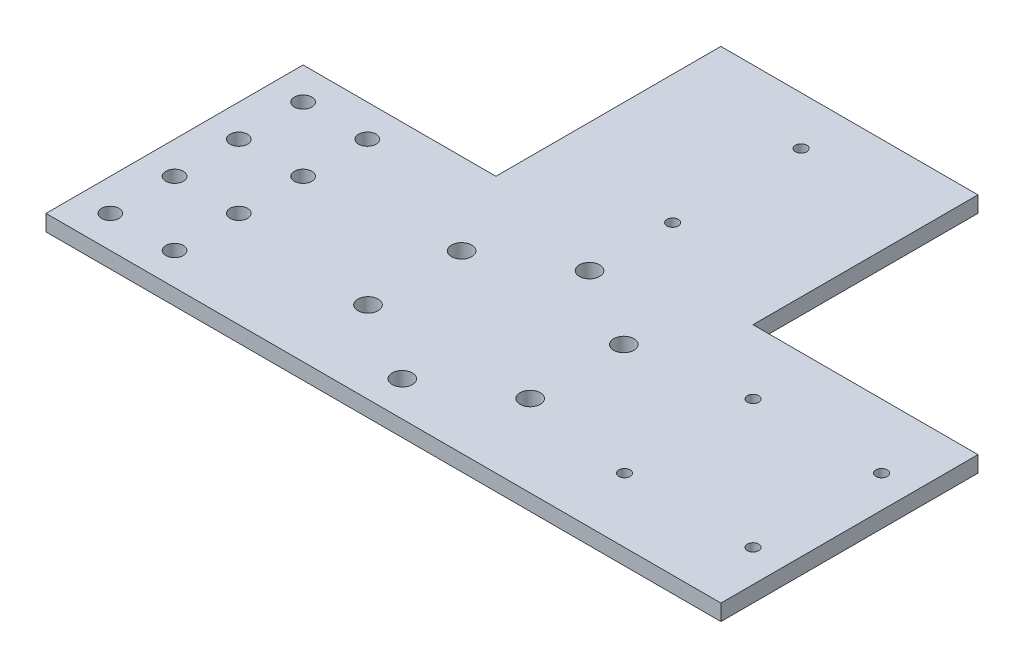
ISO-10303-21;
HEADER;
FILE_DESCRIPTION(('STEP AP214'),'2;1');
FILE_NAME('part.step','',(''),(''),'','','');
FILE_SCHEMA(('AUTOMOTIVE_DESIGN { 1 0 10303 214 1 1 1 1 }'));
ENDSEC;
DATA;
#1=APPLICATION_CONTEXT('core data for automotive mechanical design processes');
#2=APPLICATION_PROTOCOL_DEFINITION('international standard','automotive_design',2000,#1);
#3=PRODUCT_CONTEXT('',#1,'mechanical');
#4=PRODUCT('Part','Part','',(#3));
#5=PRODUCT_RELATED_PRODUCT_CATEGORY('part','',(#4));
#6=PRODUCT_DEFINITION_FORMATION('','',#4);
#7=PRODUCT_DEFINITION_CONTEXT('part definition',#1,'design');
#8=PRODUCT_DEFINITION('design','',#6,#7);
#9=PRODUCT_DEFINITION_SHAPE('','',#8);
#10=(LENGTH_UNIT() NAMED_UNIT(*) SI_UNIT(.MILLI.,.METRE.));
#11=(NAMED_UNIT(*) PLANE_ANGLE_UNIT() SI_UNIT($,.RADIAN.));
#12=(NAMED_UNIT(*) SI_UNIT($,.STERADIAN.) SOLID_ANGLE_UNIT());
#13=UNCERTAINTY_MEASURE_WITH_UNIT(LENGTH_MEASURE(1.E-05),#10,'distance_accuracy_value','');
#14=(GEOMETRIC_REPRESENTATION_CONTEXT(3) GLOBAL_UNCERTAINTY_ASSIGNED_CONTEXT((#13)) GLOBAL_UNIT_ASSIGNED_CONTEXT((#10,
#11,#12)) REPRESENTATION_CONTEXT('',''));
#15=CARTESIAN_POINT('',(0.,0.,0.));
#16=DIRECTION('',(0.,0.,1.));
#17=DIRECTION('',(1.,0.,0.));
#18=AXIS2_PLACEMENT_3D('',#15,#16,#17);
#19=CARTESIAN_POINT('',(-31.75,3.175,31.75));
#20=DIRECTION('',(0.,0.,-1.));
#21=DIRECTION('',(-1.,0.,0.));
#22=AXIS2_PLACEMENT_3D('',#19,#20,#21);
#23=PLANE('',#22);
#24=DIRECTION('',(0.,-1.,0.));
#25=VECTOR('',#24,1.);
#26=CARTESIAN_POINT('',(101.615635467388,3.175,31.75));
#27=LINE('',#26,#25);
#28=CARTESIAN_POINT('',(101.615635467388,3.175,31.75));
#29=VERTEX_POINT('',#28);
#30=CARTESIAN_POINT('',(101.615635467388,0.,31.75));
#31=VERTEX_POINT('',#30);
#32=EDGE_CURVE('E153',#29,#31,#27,.T.);
#33=ORIENTED_EDGE('',*,*,#32,.F.);
#34=DIRECTION('',(1.,0.,0.));
#35=VECTOR('',#34,1.);
#36=CARTESIAN_POINT('',(-31.75,3.175,31.75));
#37=LINE('',#36,#35);
#38=CARTESIAN_POINT('',(-31.75,3.175,31.75));
#39=VERTEX_POINT('',#38);
#40=EDGE_CURVE('E233',#39,#29,#37,.T.);
#41=ORIENTED_EDGE('',*,*,#40,.F.);
#42=DIRECTION('',(0.,-1.,0.));
#43=VECTOR('',#42,1.);
#44=CARTESIAN_POINT('',(-31.75,3.175,31.75));
#45=LINE('',#44,#43);
#46=CARTESIAN_POINT('',(-31.75,0.,31.75));
#47=VERTEX_POINT('',#46);
#48=EDGE_CURVE('E167',#39,#47,#45,.T.);
#49=ORIENTED_EDGE('',*,*,#48,.T.);
#50=DIRECTION('',(1.,0.,0.));
#51=VECTOR('',#50,1.);
#52=CARTESIAN_POINT('',(-31.75,0.,31.75));
#53=LINE('',#52,#51);
#54=EDGE_CURVE('E130',#47,#31,#53,.T.);
#55=ORIENTED_EDGE('',*,*,#54,.T.);
#56=EDGE_LOOP('',(#33,#41,#49,#55));
#57=FACE_BOUND('',#56,.T.);
#58=ADVANCED_FACE('F85',(#57),#23,.F.);
#59=CARTESIAN_POINT('',(-31.75,3.175,-19.05));
#60=DIRECTION('',(0.,0.,-1.));
#61=DIRECTION('',(-1.,0.,0.));
#62=AXIS2_PLACEMENT_3D('',#59,#60,#61);
#63=PLANE('',#62);
#64=DIRECTION('',(0.,1.,0.));
#65=VECTOR('',#64,1.);
#66=CARTESIAN_POINT('',(6.34999999999999,3.175,-19.05));
#67=LINE('',#66,#65);
#68=CARTESIAN_POINT('',(6.34999999999999,0.,-19.05));
#69=VERTEX_POINT('',#68);
#70=CARTESIAN_POINT('',(6.34999999999999,3.175,-19.05));
#71=VERTEX_POINT('',#70);
#72=EDGE_CURVE('E12',#69,#71,#67,.T.);
#73=ORIENTED_EDGE('',*,*,#72,.F.);
#74=DIRECTION('',(1.,0.,0.));
#75=VECTOR('',#74,1.);
#76=CARTESIAN_POINT('',(-31.75,0.,-19.05));
#77=LINE('',#76,#75);
#78=CARTESIAN_POINT('',(-31.75,0.,-19.05));
#79=VERTEX_POINT('',#78);
#80=EDGE_CURVE('E143',#79,#69,#77,.T.);
#81=ORIENTED_EDGE('',*,*,#80,.F.);
#82=DIRECTION('',(0.,-1.,0.));
#83=VECTOR('',#82,1.);
#84=CARTESIAN_POINT('',(-31.75,3.175,-19.05));
#85=LINE('',#84,#83);
#86=CARTESIAN_POINT('',(-31.75,3.175,-19.05));
#87=VERTEX_POINT('',#86);
#88=EDGE_CURVE('E165',#87,#79,#85,.T.);
#89=ORIENTED_EDGE('',*,*,#88,.F.);
#90=DIRECTION('',(1.,0.,0.));
#91=VECTOR('',#90,1.);
#92=CARTESIAN_POINT('',(-31.75,3.175,-19.05));
#93=LINE('',#92,#91);
#94=EDGE_CURVE('E224',#87,#71,#93,.T.);
#95=ORIENTED_EDGE('',*,*,#94,.T.);
#96=EDGE_LOOP('',(#73,#81,#89,#95));
#97=FACE_BOUND('',#96,.T.);
#98=ADVANCED_FACE('F223',(#97),#63,.T.);
#99=CARTESIAN_POINT('',(-31.75,3.175,31.75));
#100=DIRECTION('',(-1.,0.,0.));
#101=DIRECTION('',(0.,0.,1.));
#102=AXIS2_PLACEMENT_3D('',#99,#100,#101);
#103=PLANE('',#102);
#104=DIRECTION('',(0.,0.,-1.));
#105=VECTOR('',#104,1.);
#106=CARTESIAN_POINT('',(-31.75,0.,31.75));
#107=LINE('',#106,#105);
#108=EDGE_CURVE('E232',#47,#79,#107,.T.);
#109=ORIENTED_EDGE('',*,*,#108,.F.);
#110=ORIENTED_EDGE('',*,*,#48,.F.);
#111=DIRECTION('',(0.,0.,-1.));
#112=VECTOR('',#111,1.);
#113=CARTESIAN_POINT('',(-31.75,3.175,31.75));
#114=LINE('',#113,#112);
#115=EDGE_CURVE('E174',#39,#87,#114,.T.);
#116=ORIENTED_EDGE('',*,*,#115,.T.);
#117=ORIENTED_EDGE('',*,*,#88,.T.);
#118=EDGE_LOOP('',(#109,#110,#116,#117));
#119=FACE_BOUND('',#118,.T.);
#120=ADVANCED_FACE('F227',(#119),#103,.T.);
#121=CARTESIAN_POINT('',(57.15,0.,-19.05));
#122=VERTEX_POINT('',#121);
#123=CARTESIAN_POINT('',(101.615635467388,0.,-19.05));
#124=VERTEX_POINT('',#123);
#125=EDGE_CURVE('E136',#122,#124,#77,.T.);
#126=ORIENTED_EDGE('',*,*,#125,.F.);
#127=DIRECTION('',(0.,1.,0.));
#128=VECTOR('',#127,1.);
#129=CARTESIAN_POINT('',(57.15,3.175,-19.05));
#130=LINE('',#129,#128);
#131=CARTESIAN_POINT('',(57.15,3.175,-19.05));
#132=VERTEX_POINT('',#131);
#133=EDGE_CURVE('E94',#122,#132,#130,.T.);
#134=ORIENTED_EDGE('',*,*,#133,.T.);
#135=CARTESIAN_POINT('',(101.615635467388,3.175,-19.05));
#136=VERTEX_POINT('',#135);
#137=EDGE_CURVE('E149',#132,#136,#93,.T.);
#138=ORIENTED_EDGE('',*,*,#137,.T.);
#139=DIRECTION('',(0.,-1.,0.));
#140=VECTOR('',#139,1.);
#141=CARTESIAN_POINT('',(101.615635467388,3.175,-19.05));
#142=LINE('',#141,#140);
#143=EDGE_CURVE('E146',#136,#124,#142,.T.);
#144=ORIENTED_EDGE('',*,*,#143,.T.);
#145=EDGE_LOOP('',(#126,#134,#138,#144));
#146=FACE_BOUND('',#145,.T.);
#147=ADVANCED_FACE('F147',(#146),#63,.T.);
#148=CARTESIAN_POINT('',(0.,0.,0.));
#149=DIRECTION('',(0.,1.,0.));
#150=DIRECTION('',(0.,0.,1.));
#151=AXIS2_PLACEMENT_3D('',#148,#149,#150);
#152=PLANE('',#151);
#153=CARTESIAN_POINT('',(31.75,0.,-53.975));
#154=DIRECTION('',(0.,1.,0.));
#155=DIRECTION('',(0.,0.,1.));
#156=AXIS2_PLACEMENT_3D('',#153,#154,#155);
#157=CIRCLE('',#156,1.1303);
#158=CARTESIAN_POINT('',(31.75,0.,-52.8447));
#159=VERTEX_POINT('',#158);
#160=EDGE_CURVE('E345',#159,#159,#157,.T.);
#161=ORIENTED_EDGE('',*,*,#160,.T.);
#162=EDGE_LOOP('',(#161));
#163=FACE_BOUND('',#162,.T.);
#164=CARTESIAN_POINT('',(31.75,0.,-28.575));
#165=DIRECTION('',(0.,1.,0.));
#166=DIRECTION('',(0.,0.,1.));
#167=AXIS2_PLACEMENT_3D('',#164,#165,#166);
#168=CIRCLE('',#167,1.1303);
#169=CARTESIAN_POINT('',(31.75,0.,-27.4447));
#170=VERTEX_POINT('',#169);
#171=EDGE_CURVE('E339',#170,#170,#168,.T.);
#172=ORIENTED_EDGE('',*,*,#171,.T.);
#173=EDGE_LOOP('',(#172));
#174=FACE_BOUND('',#173,.T.);
#175=CARTESIAN_POINT('',(69.8656354673881,0.,-6.35000000000003));
#176=DIRECTION('',(0.,1.,0.));
#177=DIRECTION('',(0.,0.,1.));
#178=AXIS2_PLACEMENT_3D('',#175,#176,#177);
#179=CIRCLE('',#178,1.1303);
#180=CARTESIAN_POINT('',(69.8656354673881,0.,-5.21970000000003));
#181=VERTEX_POINT('',#180);
#182=EDGE_CURVE('E333',#181,#181,#179,.T.);
#183=ORIENTED_EDGE('',*,*,#182,.T.);
#184=EDGE_LOOP('',(#183));
#185=FACE_BOUND('',#184,.T.);
#186=CARTESIAN_POINT('',(95.2656354673881,0.,-6.35000000000003));
#187=DIRECTION('',(0.,1.,0.));
#188=DIRECTION('',(0.,0.,1.));
#189=AXIS2_PLACEMENT_3D('',#186,#187,#188);
#190=CIRCLE('',#189,1.1303);
#191=CARTESIAN_POINT('',(95.2656354673881,0.,-5.21970000000003));
#192=VERTEX_POINT('',#191);
#193=EDGE_CURVE('E327',#192,#192,#190,.T.);
#194=ORIENTED_EDGE('',*,*,#193,.T.);
#195=EDGE_LOOP('',(#194));
#196=FACE_BOUND('',#195,.T.);
#197=CARTESIAN_POINT('',(95.2656354673881,0.,19.05));
#198=DIRECTION('',(0.,1.,0.));
#199=DIRECTION('',(0.,0.,1.));
#200=AXIS2_PLACEMENT_3D('',#197,#198,#199);
#201=CIRCLE('',#200,1.1303);
#202=CARTESIAN_POINT('',(95.2656354673881,0.,20.1803));
#203=VERTEX_POINT('',#202);
#204=EDGE_CURVE('E321',#203,#203,#201,.T.);
#205=ORIENTED_EDGE('',*,*,#204,.T.);
#206=EDGE_LOOP('',(#205));
#207=FACE_BOUND('',#206,.T.);
#208=CARTESIAN_POINT('',(69.8656354673881,0.,19.05));
#209=DIRECTION('',(0.,1.,0.));
#210=DIRECTION('',(0.,0.,1.));
#211=AXIS2_PLACEMENT_3D('',#208,#209,#210);
#212=CIRCLE('',#211,1.1303);
#213=CARTESIAN_POINT('',(69.8656354673881,0.,20.1803));
#214=VERTEX_POINT('',#213);
#215=EDGE_CURVE('E315',#214,#214,#212,.T.);
#216=ORIENTED_EDGE('',*,*,#215,.T.);
#217=EDGE_LOOP('',(#216));
#218=FACE_BOUND('',#217,.T.);
#219=CARTESIAN_POINT('',(31.75,0.,-12.15));
#220=DIRECTION('',(0.,1.,0.));
#221=DIRECTION('',(0.,0.,1.));
#222=AXIS2_PLACEMENT_3D('',#219,#220,#221);
#223=CIRCLE('',#222,2.);
#224=CARTESIAN_POINT('',(31.75,0.,-10.15));
#225=VERTEX_POINT('',#224);
#226=EDGE_CURVE('E309',#225,#225,#223,.T.);
#227=ORIENTED_EDGE('',*,*,#226,.T.);
#228=EDGE_LOOP('',(#227));
#229=FACE_BOUND('',#228,.T.);
#230=CARTESIAN_POINT('',(47.7714699700119,0.,-2.90000000000032));
#231=DIRECTION('',(0.,1.,0.));
#232=DIRECTION('',(0.,0.,1.));
#233=AXIS2_PLACEMENT_3D('',#230,#231,#232);
#234=CIRCLE('',#233,2.);
#235=CARTESIAN_POINT('',(47.7714699700119,0.,-0.900000000000315));
#236=VERTEX_POINT('',#235);
#237=EDGE_CURVE('E303',#236,#236,#234,.T.);
#238=ORIENTED_EDGE('',*,*,#237,.T.);
#239=EDGE_LOOP('',(#238));
#240=FACE_BOUND('',#239,.T.);
#241=CARTESIAN_POINT('',(47.7714699700121,0.,15.5999999999994));
#242=DIRECTION('',(0.,1.,0.));
#243=DIRECTION('',(0.,0.,1.));
#244=AXIS2_PLACEMENT_3D('',#241,#242,#243);
#245=CIRCLE('',#244,2.);
#246=CARTESIAN_POINT('',(47.7714699700121,0.,17.5999999999994));
#247=VERTEX_POINT('',#246);
#248=EDGE_CURVE('E297',#247,#247,#245,.T.);
#249=ORIENTED_EDGE('',*,*,#248,.T.);
#250=EDGE_LOOP('',(#249));
#251=FACE_BOUND('',#250,.T.);
#252=CARTESIAN_POINT('',(31.7500000000003,0.,24.8499999999994));
#253=DIRECTION('',(0.,1.,0.));
#254=DIRECTION('',(0.,0.,1.));
#255=AXIS2_PLACEMENT_3D('',#252,#253,#254);
#256=CIRCLE('',#255,2.);
#257=CARTESIAN_POINT('',(31.7500000000003,0.,26.8499999999994));
#258=VERTEX_POINT('',#257);
#259=EDGE_CURVE('E291',#258,#258,#256,.T.);
#260=ORIENTED_EDGE('',*,*,#259,.T.);
#261=EDGE_LOOP('',(#260));
#262=FACE_BOUND('',#261,.T.);
#263=CARTESIAN_POINT('',(15.7285300299884,0.,15.5999999999997));
#264=DIRECTION('',(0.,1.,0.));
#265=DIRECTION('',(0.,0.,1.));
#266=AXIS2_PLACEMENT_3D('',#263,#264,#265);
#267=CIRCLE('',#266,2.);
#268=CARTESIAN_POINT('',(15.7285300299884,0.,17.5999999999997));
#269=VERTEX_POINT('',#268);
#270=EDGE_CURVE('E285',#269,#269,#267,.T.);
#271=ORIENTED_EDGE('',*,*,#270,.T.);
#272=EDGE_LOOP('',(#271));
#273=FACE_BOUND('',#272,.T.);
#274=CARTESIAN_POINT('',(15.7285300299882,0.,-2.90000000000002));
#275=DIRECTION('',(0.,1.,0.));
#276=DIRECTION('',(0.,0.,1.));
#277=AXIS2_PLACEMENT_3D('',#274,#275,#276);
#278=CIRCLE('',#277,2.);
#279=CARTESIAN_POINT('',(15.7285300299882,0.,-0.900000000000022));
#280=VERTEX_POINT('',#279);
#281=EDGE_CURVE('E279',#280,#280,#278,.T.);
#282=ORIENTED_EDGE('',*,*,#281,.T.);
#283=EDGE_LOOP('',(#282));
#284=FACE_BOUND('',#283,.T.);
#285=CARTESIAN_POINT('',(-12.6999999999999,0.,0.));
#286=DIRECTION('',(0.,1.,0.));
#287=DIRECTION('',(0.,0.,1.));
#288=AXIS2_PLACEMENT_3D('',#285,#286,#287);
#289=CIRCLE('',#288,1.7272);
#290=CARTESIAN_POINT('',(-12.6999999999999,0.,1.72719999999998));
#291=VERTEX_POINT('',#290);
#292=EDGE_CURVE('E273',#291,#291,#289,.T.);
#293=ORIENTED_EDGE('',*,*,#292,.T.);
#294=EDGE_LOOP('',(#293));
#295=FACE_BOUND('',#294,.T.);
#296=CARTESIAN_POINT('',(-25.3999999999999,0.,0.));
#297=DIRECTION('',(0.,1.,0.));
#298=DIRECTION('',(0.,0.,1.));
#299=AXIS2_PLACEMENT_3D('',#296,#297,#298);
#300=CIRCLE('',#299,1.7272);
#301=CARTESIAN_POINT('',(-25.3999999999999,0.,1.72719999999997));
#302=VERTEX_POINT('',#301);
#303=EDGE_CURVE('E267',#302,#302,#300,.T.);
#304=ORIENTED_EDGE('',*,*,#303,.T.);
#305=EDGE_LOOP('',(#304));
#306=FACE_BOUND('',#305,.T.);
#307=CARTESIAN_POINT('',(-25.3999999999997,0.,12.7));
#308=DIRECTION('',(0.,1.,0.));
#309=DIRECTION('',(0.,0.,1.));
#310=AXIS2_PLACEMENT_3D('',#307,#308,#309);
#311=CIRCLE('',#310,1.7272);
#312=CARTESIAN_POINT('',(-25.3999999999997,0.,14.4272));
#313=VERTEX_POINT('',#312);
#314=EDGE_CURVE('E261',#313,#313,#311,.T.);
#315=ORIENTED_EDGE('',*,*,#314,.T.);
#316=EDGE_LOOP('',(#315));
#317=FACE_BOUND('',#316,.T.);
#318=CARTESIAN_POINT('',(-25.3999999999996,0.,25.4));
#319=DIRECTION('',(0.,1.,0.));
#320=DIRECTION('',(0.,0.,1.));
#321=AXIS2_PLACEMENT_3D('',#318,#319,#320);
#322=CIRCLE('',#321,1.7272);
#323=CARTESIAN_POINT('',(-25.3999999999996,0.,27.1272));
#324=VERTEX_POINT('',#323);
#325=EDGE_CURVE('E255',#324,#324,#322,.T.);
#326=ORIENTED_EDGE('',*,*,#325,.T.);
#327=EDGE_LOOP('',(#326));
#328=FACE_BOUND('',#327,.T.);
#329=CARTESIAN_POINT('',(-12.6999999999996,0.,25.4));
#330=DIRECTION('',(0.,1.,0.));
#331=DIRECTION('',(0.,0.,1.));
#332=AXIS2_PLACEMENT_3D('',#329,#330,#331);
#333=CIRCLE('',#332,1.7272);
#334=CARTESIAN_POINT('',(-12.6999999999996,0.,27.1272));
#335=VERTEX_POINT('',#334);
#336=EDGE_CURVE('E249',#335,#335,#333,.T.);
#337=ORIENTED_EDGE('',*,*,#336,.T.);
#338=EDGE_LOOP('',(#337));
#339=FACE_BOUND('',#338,.T.);
#340=CARTESIAN_POINT('',(-12.7,0.,-12.7));
#341=DIRECTION('',(0.,1.,0.));
#342=DIRECTION('',(0.,0.,1.));
#343=AXIS2_PLACEMENT_3D('',#340,#341,#342);
#344=CIRCLE('',#343,1.7272);
#345=CARTESIAN_POINT('',(-12.7,0.,-10.9728));
#346=VERTEX_POINT('',#345);
#347=EDGE_CURVE('E243',#346,#346,#344,.T.);
#348=ORIENTED_EDGE('',*,*,#347,.T.);
#349=EDGE_LOOP('',(#348));
#350=FACE_BOUND('',#349,.T.);
#351=CARTESIAN_POINT('',(-25.4,0.,-12.7));
#352=DIRECTION('',(0.,1.,0.));
#353=DIRECTION('',(0.,0.,1.));
#354=AXIS2_PLACEMENT_3D('',#351,#352,#353);
#355=CIRCLE('',#354,1.7272);
#356=CARTESIAN_POINT('',(-25.4,0.,-10.9728));
#357=VERTEX_POINT('',#356);
#358=EDGE_CURVE('E237',#357,#357,#355,.T.);
#359=ORIENTED_EDGE('',*,*,#358,.T.);
#360=EDGE_LOOP('',(#359));
#361=FACE_BOUND('',#360,.T.);
#362=CARTESIAN_POINT('',(-12.6999999999997,0.,12.7));
#363=DIRECTION('',(0.,1.,0.));
#364=DIRECTION('',(0.,0.,1.));
#365=AXIS2_PLACEMENT_3D('',#362,#363,#364);
#366=CIRCLE('',#365,1.7272);
#367=CARTESIAN_POINT('',(-12.6999999999997,0.,14.4272));
#368=VERTEX_POINT('',#367);
#369=EDGE_CURVE('E156',#368,#368,#366,.T.);
#370=ORIENTED_EDGE('',*,*,#369,.T.);
#371=EDGE_LOOP('',(#370));
#372=FACE_BOUND('',#371,.T.);
#373=DIRECTION('',(0.,0.,1.));
#374=VECTOR('',#373,1.);
#375=CARTESIAN_POINT('',(101.615635467388,0.,-19.05));
#376=LINE('',#375,#374);
#377=EDGE_CURVE('E140',#124,#31,#376,.T.);
#378=ORIENTED_EDGE('',*,*,#377,.T.);
#379=ORIENTED_EDGE('',*,*,#54,.F.);
#380=ORIENTED_EDGE('',*,*,#108,.T.);
#381=ORIENTED_EDGE('',*,*,#80,.T.);
#382=DIRECTION('',(0.,0.,-1.));
#383=VECTOR('',#382,1.);
#384=CARTESIAN_POINT('',(6.34999999999999,0.,31.75));
#385=LINE('',#384,#383);
#386=CARTESIAN_POINT('',(6.34999999999999,0.,-63.5));
#387=VERTEX_POINT('',#386);
#388=EDGE_CURVE('E182',#69,#387,#385,.T.);
#389=ORIENTED_EDGE('',*,*,#388,.T.);
#390=DIRECTION('',(1.,0.,0.));
#391=VECTOR('',#390,1.);
#392=CARTESIAN_POINT('',(6.34999999999999,0.,-63.5));
#393=LINE('',#392,#391);
#394=CARTESIAN_POINT('',(57.15,0.,-63.5));
#395=VERTEX_POINT('',#394);
#396=EDGE_CURVE('E164',#387,#395,#393,.T.);
#397=ORIENTED_EDGE('',*,*,#396,.T.);
#398=DIRECTION('',(0.,0.,-1.));
#399=VECTOR('',#398,1.);
#400=CARTESIAN_POINT('',(57.15,0.,31.75));
#401=LINE('',#400,#399);
#402=EDGE_CURVE('E142',#122,#395,#401,.T.);
#403=ORIENTED_EDGE('',*,*,#402,.F.);
#404=ORIENTED_EDGE('',*,*,#125,.T.);
#405=EDGE_LOOP('',(#378,#379,#380,#381,#389,#397,#403,#404));
#406=FACE_BOUND('',#405,.T.);
#407=ADVANCED_FACE('F138',(#163,#174,#185,#196,#207,#218,#229,#240,#251,#262,#273,#284,#295,
#306,#317,#328,#339,#350,#361,#372,#406),#152,.F.);
#408=CARTESIAN_POINT('',(0.,3.175,0.));
#409=DIRECTION('',(0.,1.,0.));
#410=DIRECTION('',(0.,0.,1.));
#411=AXIS2_PLACEMENT_3D('',#408,#409,#410);
#412=PLANE('',#411);
#413=CARTESIAN_POINT('',(31.75,3.175,-53.975));
#414=DIRECTION('',(0.,1.,0.));
#415=DIRECTION('',(0.,0.,1.));
#416=AXIS2_PLACEMENT_3D('',#413,#414,#415);
#417=CIRCLE('',#416,1.1303);
#418=CARTESIAN_POINT('',(31.75,3.175,-52.8447));
#419=VERTEX_POINT('',#418);
#420=EDGE_CURVE('E348',#419,#419,#417,.T.);
#421=ORIENTED_EDGE('',*,*,#420,.F.);
#422=EDGE_LOOP('',(#421));
#423=FACE_BOUND('',#422,.T.);
#424=CARTESIAN_POINT('',(31.75,3.175,-28.575));
#425=DIRECTION('',(0.,1.,0.));
#426=DIRECTION('',(0.,0.,1.));
#427=AXIS2_PLACEMENT_3D('',#424,#425,#426);
#428=CIRCLE('',#427,1.1303);
#429=CARTESIAN_POINT('',(31.75,3.175,-27.4447));
#430=VERTEX_POINT('',#429);
#431=EDGE_CURVE('E342',#430,#430,#428,.T.);
#432=ORIENTED_EDGE('',*,*,#431,.F.);
#433=EDGE_LOOP('',(#432));
#434=FACE_BOUND('',#433,.T.);
#435=CARTESIAN_POINT('',(69.8656354673881,3.175,-6.35000000000003));
#436=DIRECTION('',(0.,1.,0.));
#437=DIRECTION('',(0.,0.,1.));
#438=AXIS2_PLACEMENT_3D('',#435,#436,#437);
#439=CIRCLE('',#438,1.1303);
#440=CARTESIAN_POINT('',(69.8656354673881,3.175,-5.21970000000003));
#441=VERTEX_POINT('',#440);
#442=EDGE_CURVE('E336',#441,#441,#439,.T.);
#443=ORIENTED_EDGE('',*,*,#442,.F.);
#444=EDGE_LOOP('',(#443));
#445=FACE_BOUND('',#444,.T.);
#446=CARTESIAN_POINT('',(95.2656354673881,3.175,-6.35000000000003));
#447=DIRECTION('',(0.,1.,0.));
#448=DIRECTION('',(0.,0.,1.));
#449=AXIS2_PLACEMENT_3D('',#446,#447,#448);
#450=CIRCLE('',#449,1.1303);
#451=CARTESIAN_POINT('',(95.2656354673881,3.175,-5.21970000000003));
#452=VERTEX_POINT('',#451);
#453=EDGE_CURVE('E330',#452,#452,#450,.T.);
#454=ORIENTED_EDGE('',*,*,#453,.F.);
#455=EDGE_LOOP('',(#454));
#456=FACE_BOUND('',#455,.T.);
#457=CARTESIAN_POINT('',(95.2656354673881,3.175,19.05));
#458=DIRECTION('',(0.,1.,0.));
#459=DIRECTION('',(0.,0.,1.));
#460=AXIS2_PLACEMENT_3D('',#457,#458,#459);
#461=CIRCLE('',#460,1.1303);
#462=CARTESIAN_POINT('',(95.2656354673881,3.175,20.1803));
#463=VERTEX_POINT('',#462);
#464=EDGE_CURVE('E324',#463,#463,#461,.T.);
#465=ORIENTED_EDGE('',*,*,#464,.F.);
#466=EDGE_LOOP('',(#465));
#467=FACE_BOUND('',#466,.T.);
#468=CARTESIAN_POINT('',(69.8656354673881,3.175,19.05));
#469=DIRECTION('',(0.,1.,0.));
#470=DIRECTION('',(0.,0.,1.));
#471=AXIS2_PLACEMENT_3D('',#468,#469,#470);
#472=CIRCLE('',#471,1.1303);
#473=CARTESIAN_POINT('',(69.8656354673881,3.175,20.1803));
#474=VERTEX_POINT('',#473);
#475=EDGE_CURVE('E318',#474,#474,#472,.T.);
#476=ORIENTED_EDGE('',*,*,#475,.F.);
#477=EDGE_LOOP('',(#476));
#478=FACE_BOUND('',#477,.T.);
#479=CARTESIAN_POINT('',(31.75,3.175,-12.15));
#480=DIRECTION('',(0.,1.,0.));
#481=DIRECTION('',(0.,0.,1.));
#482=AXIS2_PLACEMENT_3D('',#479,#480,#481);
#483=CIRCLE('',#482,2.);
#484=CARTESIAN_POINT('',(31.75,3.175,-10.15));
#485=VERTEX_POINT('',#484);
#486=EDGE_CURVE('E312',#485,#485,#483,.T.);
#487=ORIENTED_EDGE('',*,*,#486,.F.);
#488=EDGE_LOOP('',(#487));
#489=FACE_BOUND('',#488,.T.);
#490=CARTESIAN_POINT('',(47.7714699700119,3.175,-2.90000000000032));
#491=DIRECTION('',(0.,1.,0.));
#492=DIRECTION('',(0.,0.,1.));
#493=AXIS2_PLACEMENT_3D('',#490,#491,#492);
#494=CIRCLE('',#493,2.);
#495=CARTESIAN_POINT('',(47.7714699700119,3.175,-0.900000000000315));
#496=VERTEX_POINT('',#495);
#497=EDGE_CURVE('E306',#496,#496,#494,.T.);
#498=ORIENTED_EDGE('',*,*,#497,.F.);
#499=EDGE_LOOP('',(#498));
#500=FACE_BOUND('',#499,.T.);
#501=CARTESIAN_POINT('',(47.7714699700121,3.175,15.5999999999994));
#502=DIRECTION('',(0.,1.,0.));
#503=DIRECTION('',(0.,0.,1.));
#504=AXIS2_PLACEMENT_3D('',#501,#502,#503);
#505=CIRCLE('',#504,2.);
#506=CARTESIAN_POINT('',(47.7714699700121,3.175,17.5999999999994));
#507=VERTEX_POINT('',#506);
#508=EDGE_CURVE('E300',#507,#507,#505,.T.);
#509=ORIENTED_EDGE('',*,*,#508,.F.);
#510=EDGE_LOOP('',(#509));
#511=FACE_BOUND('',#510,.T.);
#512=CARTESIAN_POINT('',(31.7500000000003,3.175,24.8499999999994));
#513=DIRECTION('',(0.,1.,0.));
#514=DIRECTION('',(0.,0.,1.));
#515=AXIS2_PLACEMENT_3D('',#512,#513,#514);
#516=CIRCLE('',#515,2.);
#517=CARTESIAN_POINT('',(31.7500000000003,3.175,26.8499999999994));
#518=VERTEX_POINT('',#517);
#519=EDGE_CURVE('E294',#518,#518,#516,.T.);
#520=ORIENTED_EDGE('',*,*,#519,.F.);
#521=EDGE_LOOP('',(#520));
#522=FACE_BOUND('',#521,.T.);
#523=CARTESIAN_POINT('',(15.7285300299884,3.175,15.5999999999997));
#524=DIRECTION('',(0.,1.,0.));
#525=DIRECTION('',(0.,0.,1.));
#526=AXIS2_PLACEMENT_3D('',#523,#524,#525);
#527=CIRCLE('',#526,2.);
#528=CARTESIAN_POINT('',(15.7285300299884,3.175,17.5999999999997));
#529=VERTEX_POINT('',#528);
#530=EDGE_CURVE('E288',#529,#529,#527,.T.);
#531=ORIENTED_EDGE('',*,*,#530,.F.);
#532=EDGE_LOOP('',(#531));
#533=FACE_BOUND('',#532,.T.);
#534=CARTESIAN_POINT('',(15.7285300299882,3.175,-2.90000000000002));
#535=DIRECTION('',(0.,1.,0.));
#536=DIRECTION('',(0.,0.,1.));
#537=AXIS2_PLACEMENT_3D('',#534,#535,#536);
#538=CIRCLE('',#537,2.);
#539=CARTESIAN_POINT('',(15.7285300299882,3.175,-0.900000000000019));
#540=VERTEX_POINT('',#539);
#541=EDGE_CURVE('E282',#540,#540,#538,.T.);
#542=ORIENTED_EDGE('',*,*,#541,.F.);
#543=EDGE_LOOP('',(#542));
#544=FACE_BOUND('',#543,.T.);
#545=CARTESIAN_POINT('',(-12.6999999999999,3.175,0.));
#546=DIRECTION('',(0.,1.,0.));
#547=DIRECTION('',(0.,0.,1.));
#548=AXIS2_PLACEMENT_3D('',#545,#546,#547);
#549=CIRCLE('',#548,1.7272);
#550=CARTESIAN_POINT('',(-12.6999999999999,3.175,1.72719999999998));
#551=VERTEX_POINT('',#550);
#552=EDGE_CURVE('E276',#551,#551,#549,.T.);
#553=ORIENTED_EDGE('',*,*,#552,.F.);
#554=EDGE_LOOP('',(#553));
#555=FACE_BOUND('',#554,.T.);
#556=CARTESIAN_POINT('',(-25.3999999999999,3.175,0.));
#557=DIRECTION('',(0.,1.,0.));
#558=DIRECTION('',(0.,0.,1.));
#559=AXIS2_PLACEMENT_3D('',#556,#557,#558);
#560=CIRCLE('',#559,1.7272);
#561=CARTESIAN_POINT('',(-25.3999999999999,3.175,1.72719999999997));
#562=VERTEX_POINT('',#561);
#563=EDGE_CURVE('E270',#562,#562,#560,.T.);
#564=ORIENTED_EDGE('',*,*,#563,.F.);
#565=EDGE_LOOP('',(#564));
#566=FACE_BOUND('',#565,.T.);
#567=CARTESIAN_POINT('',(-25.3999999999997,3.175,12.7));
#568=DIRECTION('',(0.,1.,0.));
#569=DIRECTION('',(0.,0.,1.));
#570=AXIS2_PLACEMENT_3D('',#567,#568,#569);
#571=CIRCLE('',#570,1.7272);
#572=CARTESIAN_POINT('',(-25.3999999999997,3.175,14.4272));
#573=VERTEX_POINT('',#572);
#574=EDGE_CURVE('E264',#573,#573,#571,.T.);
#575=ORIENTED_EDGE('',*,*,#574,.F.);
#576=EDGE_LOOP('',(#575));
#577=FACE_BOUND('',#576,.T.);
#578=CARTESIAN_POINT('',(-25.3999999999996,3.175,25.4));
#579=DIRECTION('',(0.,1.,0.));
#580=DIRECTION('',(0.,0.,1.));
#581=AXIS2_PLACEMENT_3D('',#578,#579,#580);
#582=CIRCLE('',#581,1.7272);
#583=CARTESIAN_POINT('',(-25.3999999999996,3.175,27.1272));
#584=VERTEX_POINT('',#583);
#585=EDGE_CURVE('E258',#584,#584,#582,.T.);
#586=ORIENTED_EDGE('',*,*,#585,.F.);
#587=EDGE_LOOP('',(#586));
#588=FACE_BOUND('',#587,.T.);
#589=CARTESIAN_POINT('',(-12.6999999999996,3.175,25.4));
#590=DIRECTION('',(0.,1.,0.));
#591=DIRECTION('',(0.,0.,1.));
#592=AXIS2_PLACEMENT_3D('',#589,#590,#591);
#593=CIRCLE('',#592,1.7272);
#594=CARTESIAN_POINT('',(-12.6999999999996,3.175,27.1272));
#595=VERTEX_POINT('',#594);
#596=EDGE_CURVE('E252',#595,#595,#593,.T.);
#597=ORIENTED_EDGE('',*,*,#596,.F.);
#598=EDGE_LOOP('',(#597));
#599=FACE_BOUND('',#598,.T.);
#600=CARTESIAN_POINT('',(-12.7,3.175,-12.7));
#601=DIRECTION('',(0.,1.,0.));
#602=DIRECTION('',(0.,0.,1.));
#603=AXIS2_PLACEMENT_3D('',#600,#601,#602);
#604=CIRCLE('',#603,1.7272);
#605=CARTESIAN_POINT('',(-12.7,3.175,-10.9728));
#606=VERTEX_POINT('',#605);
#607=EDGE_CURVE('E246',#606,#606,#604,.T.);
#608=ORIENTED_EDGE('',*,*,#607,.F.);
#609=EDGE_LOOP('',(#608));
#610=FACE_BOUND('',#609,.T.);
#611=CARTESIAN_POINT('',(-25.4,3.175,-12.7));
#612=DIRECTION('',(0.,1.,0.));
#613=DIRECTION('',(0.,0.,1.));
#614=AXIS2_PLACEMENT_3D('',#611,#612,#613);
#615=CIRCLE('',#614,1.7272);
#616=CARTESIAN_POINT('',(-25.4,3.175,-10.9728));
#617=VERTEX_POINT('',#616);
#618=EDGE_CURVE('E240',#617,#617,#615,.T.);
#619=ORIENTED_EDGE('',*,*,#618,.F.);
#620=EDGE_LOOP('',(#619));
#621=FACE_BOUND('',#620,.T.);
#622=CARTESIAN_POINT('',(-12.6999999999997,3.175,12.7));
#623=DIRECTION('',(0.,1.,0.));
#624=DIRECTION('',(0.,0.,1.));
#625=AXIS2_PLACEMENT_3D('',#622,#623,#624);
#626=CIRCLE('',#625,1.7272);
#627=CARTESIAN_POINT('',(-12.6999999999997,3.175,14.4272));
#628=VERTEX_POINT('',#627);
#629=EDGE_CURVE('E160',#628,#628,#626,.T.);
#630=ORIENTED_EDGE('',*,*,#629,.F.);
#631=EDGE_LOOP('',(#630));
#632=FACE_BOUND('',#631,.T.);
#633=ORIENTED_EDGE('',*,*,#137,.F.);
#634=DIRECTION('',(0.,0.,-1.));
#635=VECTOR('',#634,1.);
#636=CARTESIAN_POINT('',(57.15,3.175,31.75));
#637=LINE('',#636,#635);
#638=CARTESIAN_POINT('',(57.15,3.175,-63.5));
#639=VERTEX_POINT('',#638);
#640=EDGE_CURVE('E181',#132,#639,#637,.T.);
#641=ORIENTED_EDGE('',*,*,#640,.T.);
#642=DIRECTION('',(1.,0.,0.));
#643=VECTOR('',#642,1.);
#644=CARTESIAN_POINT('',(6.34999999999999,3.175,-63.5));
#645=LINE('',#644,#643);
#646=CARTESIAN_POINT('',(6.34999999999999,3.175,-63.5));
#647=VERTEX_POINT('',#646);
#648=EDGE_CURVE('E178',#647,#639,#645,.T.);
#649=ORIENTED_EDGE('',*,*,#648,.F.);
#650=DIRECTION('',(0.,0.,-1.));
#651=VECTOR('',#650,1.);
#652=CARTESIAN_POINT('',(6.34999999999999,3.175,31.75));
#653=LINE('',#652,#651);
#654=EDGE_CURVE('E184',#71,#647,#653,.T.);
#655=ORIENTED_EDGE('',*,*,#654,.F.);
#656=ORIENTED_EDGE('',*,*,#94,.F.);
#657=ORIENTED_EDGE('',*,*,#115,.F.);
#658=ORIENTED_EDGE('',*,*,#40,.T.);
#659=DIRECTION('',(0.,0.,1.));
#660=VECTOR('',#659,1.);
#661=CARTESIAN_POINT('',(101.615635467388,3.175,-19.05));
#662=LINE('',#661,#660);
#663=EDGE_CURVE('E154',#136,#29,#662,.T.);
#664=ORIENTED_EDGE('',*,*,#663,.F.);
#665=EDGE_LOOP('',(#633,#641,#649,#655,#656,#657,#658,#664));
#666=FACE_BOUND('',#665,.T.);
#667=ADVANCED_FACE('F208',(#423,#434,#445,#456,#467,#478,#489,#500,#511,#522,#533,#544,#555,
#566,#577,#588,#599,#610,#621,#632,#666),#412,.T.);
#668=CARTESIAN_POINT('',(101.615635467388,3.175,-19.05));
#669=DIRECTION('',(1.,0.,0.));
#670=DIRECTION('',(0.,0.,-1.));
#671=AXIS2_PLACEMENT_3D('',#668,#669,#670);
#672=PLANE('',#671);
#673=ORIENTED_EDGE('',*,*,#377,.F.);
#674=ORIENTED_EDGE('',*,*,#143,.F.);
#675=ORIENTED_EDGE('',*,*,#663,.T.);
#676=ORIENTED_EDGE('',*,*,#32,.T.);
#677=EDGE_LOOP('',(#673,#674,#675,#676));
#678=FACE_BOUND('',#677,.T.);
#679=ADVANCED_FACE('F87',(#678),#672,.T.);
#680=CARTESIAN_POINT('',(57.15,3.175,31.75));
#681=DIRECTION('',(-1.,0.,0.));
#682=DIRECTION('',(0.,0.,1.));
#683=AXIS2_PLACEMENT_3D('',#680,#681,#682);
#684=PLANE('',#683);
#685=ORIENTED_EDGE('',*,*,#133,.F.);
#686=ORIENTED_EDGE('',*,*,#402,.T.);
#687=DIRECTION('',(0.,-1.,0.));
#688=VECTOR('',#687,1.);
#689=CARTESIAN_POINT('',(57.15,3.175,-63.5));
#690=LINE('',#689,#688);
#691=EDGE_CURVE('E186',#639,#395,#690,.T.);
#692=ORIENTED_EDGE('',*,*,#691,.F.);
#693=ORIENTED_EDGE('',*,*,#640,.F.);
#694=EDGE_LOOP('',(#685,#686,#692,#693));
#695=FACE_BOUND('',#694,.T.);
#696=ADVANCED_FACE('F211',(#695),#684,.F.);
#697=CARTESIAN_POINT('',(6.34999999999999,3.175,-63.5));
#698=DIRECTION('',(0.,0.,-1.));
#699=DIRECTION('',(-1.,0.,0.));
#700=AXIS2_PLACEMENT_3D('',#697,#698,#699);
#701=PLANE('',#700);
#702=ORIENTED_EDGE('',*,*,#396,.F.);
#703=DIRECTION('',(0.,-1.,0.));
#704=VECTOR('',#703,1.);
#705=CARTESIAN_POINT('',(6.34999999999999,3.175,-63.5));
#706=LINE('',#705,#704);
#707=EDGE_CURVE('E190',#647,#387,#706,.T.);
#708=ORIENTED_EDGE('',*,*,#707,.F.);
#709=ORIENTED_EDGE('',*,*,#648,.T.);
#710=ORIENTED_EDGE('',*,*,#691,.T.);
#711=EDGE_LOOP('',(#702,#708,#709,#710));
#712=FACE_BOUND('',#711,.T.);
#713=ADVANCED_FACE('F196',(#712),#701,.T.);
#714=CARTESIAN_POINT('',(6.34999999999999,3.175,31.75));
#715=DIRECTION('',(-1.,0.,0.));
#716=DIRECTION('',(0.,0.,1.));
#717=AXIS2_PLACEMENT_3D('',#714,#715,#716);
#718=PLANE('',#717);
#719=ORIENTED_EDGE('',*,*,#388,.F.);
#720=ORIENTED_EDGE('',*,*,#72,.T.);
#721=ORIENTED_EDGE('',*,*,#654,.T.);
#722=ORIENTED_EDGE('',*,*,#707,.T.);
#723=EDGE_LOOP('',(#719,#720,#721,#722));
#724=FACE_BOUND('',#723,.T.);
#725=ADVANCED_FACE('F205',(#724),#718,.T.);
#726=CARTESIAN_POINT('',(-12.6999999999997,3.175,12.7));
#727=DIRECTION('',(0.,1.,0.));
#728=DIRECTION('',(0.,0.,1.));
#729=AXIS2_PLACEMENT_3D('',#726,#727,#728);
#730=CYLINDRICAL_SURFACE('',#729,1.7272);
#731=ORIENTED_EDGE('',*,*,#369,.F.);
#732=EDGE_LOOP('',(#731));
#733=FACE_BOUND('',#732,.T.);
#734=ORIENTED_EDGE('',*,*,#629,.T.);
#735=EDGE_LOOP('',(#734));
#736=FACE_BOUND('',#735,.T.);
#737=ADVANCED_FACE('F395',(#733,#736),#730,.F.);
#738=CARTESIAN_POINT('',(-25.4,3.175,-12.7));
#739=DIRECTION('',(0.,1.,0.));
#740=DIRECTION('',(0.,0.,1.));
#741=AXIS2_PLACEMENT_3D('',#738,#739,#740);
#742=CYLINDRICAL_SURFACE('',#741,1.7272);
#743=ORIENTED_EDGE('',*,*,#358,.F.);
#744=EDGE_LOOP('',(#743));
#745=FACE_BOUND('',#744,.T.);
#746=ORIENTED_EDGE('',*,*,#618,.T.);
#747=EDGE_LOOP('',(#746));
#748=FACE_BOUND('',#747,.T.);
#749=ADVANCED_FACE('F397',(#745,#748),#742,.F.);
#750=CARTESIAN_POINT('',(-12.7,3.175,-12.7));
#751=DIRECTION('',(0.,1.,0.));
#752=DIRECTION('',(0.,0.,1.));
#753=AXIS2_PLACEMENT_3D('',#750,#751,#752);
#754=CYLINDRICAL_SURFACE('',#753,1.7272);
#755=ORIENTED_EDGE('',*,*,#347,.F.);
#756=EDGE_LOOP('',(#755));
#757=FACE_BOUND('',#756,.T.);
#758=ORIENTED_EDGE('',*,*,#607,.T.);
#759=EDGE_LOOP('',(#758));
#760=FACE_BOUND('',#759,.T.);
#761=ADVANCED_FACE('F404',(#757,#760),#754,.F.);
#762=CARTESIAN_POINT('',(-12.6999999999996,3.175,25.4));
#763=DIRECTION('',(0.,1.,0.));
#764=DIRECTION('',(0.,0.,1.));
#765=AXIS2_PLACEMENT_3D('',#762,#763,#764);
#766=CYLINDRICAL_SURFACE('',#765,1.7272);
#767=ORIENTED_EDGE('',*,*,#336,.F.);
#768=EDGE_LOOP('',(#767));
#769=FACE_BOUND('',#768,.T.);
#770=ORIENTED_EDGE('',*,*,#596,.T.);
#771=EDGE_LOOP('',(#770));
#772=FACE_BOUND('',#771,.T.);
#773=ADVANCED_FACE('F468',(#769,#772),#766,.F.);
#774=CARTESIAN_POINT('',(-25.3999999999996,3.175,25.4));
#775=DIRECTION('',(0.,1.,0.));
#776=DIRECTION('',(0.,0.,1.));
#777=AXIS2_PLACEMENT_3D('',#774,#775,#776);
#778=CYLINDRICAL_SURFACE('',#777,1.7272);
#779=ORIENTED_EDGE('',*,*,#325,.F.);
#780=EDGE_LOOP('',(#779));
#781=FACE_BOUND('',#780,.T.);
#782=ORIENTED_EDGE('',*,*,#585,.T.);
#783=EDGE_LOOP('',(#782));
#784=FACE_BOUND('',#783,.T.);
#785=ADVANCED_FACE('F473',(#781,#784),#778,.F.);
#786=CARTESIAN_POINT('',(-25.3999999999997,3.175,12.7));
#787=DIRECTION('',(0.,1.,0.));
#788=DIRECTION('',(0.,0.,1.));
#789=AXIS2_PLACEMENT_3D('',#786,#787,#788);
#790=CYLINDRICAL_SURFACE('',#789,1.7272);
#791=ORIENTED_EDGE('',*,*,#314,.F.);
#792=EDGE_LOOP('',(#791));
#793=FACE_BOUND('',#792,.T.);
#794=ORIENTED_EDGE('',*,*,#574,.T.);
#795=EDGE_LOOP('',(#794));
#796=FACE_BOUND('',#795,.T.);
#797=ADVANCED_FACE('F479',(#793,#796),#790,.F.);
#798=CARTESIAN_POINT('',(-25.3999999999999,3.175,0.));
#799=DIRECTION('',(0.,1.,0.));
#800=DIRECTION('',(0.,0.,1.));
#801=AXIS2_PLACEMENT_3D('',#798,#799,#800);
#802=CYLINDRICAL_SURFACE('',#801,1.7272);
#803=ORIENTED_EDGE('',*,*,#303,.F.);
#804=EDGE_LOOP('',(#803));
#805=FACE_BOUND('',#804,.T.);
#806=ORIENTED_EDGE('',*,*,#563,.T.);
#807=EDGE_LOOP('',(#806));
#808=FACE_BOUND('',#807,.T.);
#809=ADVANCED_FACE('F483',(#805,#808),#802,.F.);
#810=CARTESIAN_POINT('',(-12.6999999999999,3.175,0.));
#811=DIRECTION('',(0.,1.,0.));
#812=DIRECTION('',(0.,0.,1.));
#813=AXIS2_PLACEMENT_3D('',#810,#811,#812);
#814=CYLINDRICAL_SURFACE('',#813,1.7272);
#815=ORIENTED_EDGE('',*,*,#292,.F.);
#816=EDGE_LOOP('',(#815));
#817=FACE_BOUND('',#816,.T.);
#818=ORIENTED_EDGE('',*,*,#552,.T.);
#819=EDGE_LOOP('',(#818));
#820=FACE_BOUND('',#819,.T.);
#821=ADVANCED_FACE('F487',(#817,#820),#814,.F.);
#822=CARTESIAN_POINT('',(15.7285300299882,3.175,-2.90000000000002));
#823=DIRECTION('',(0.,1.,0.));
#824=DIRECTION('',(0.,0.,1.));
#825=AXIS2_PLACEMENT_3D('',#822,#823,#824);
#826=CYLINDRICAL_SURFACE('',#825,2.);
#827=ORIENTED_EDGE('',*,*,#281,.F.);
#828=EDGE_LOOP('',(#827));
#829=FACE_BOUND('',#828,.T.);
#830=ORIENTED_EDGE('',*,*,#541,.T.);
#831=EDGE_LOOP('',(#830));
#832=FACE_BOUND('',#831,.T.);
#833=ADVANCED_FACE('F491',(#829,#832),#826,.F.);
#834=CARTESIAN_POINT('',(15.7285300299884,3.175,15.5999999999997));
#835=DIRECTION('',(0.,1.,0.));
#836=DIRECTION('',(0.,0.,1.));
#837=AXIS2_PLACEMENT_3D('',#834,#835,#836);
#838=CYLINDRICAL_SURFACE('',#837,2.);
#839=ORIENTED_EDGE('',*,*,#270,.F.);
#840=EDGE_LOOP('',(#839));
#841=FACE_BOUND('',#840,.T.);
#842=ORIENTED_EDGE('',*,*,#530,.T.);
#843=EDGE_LOOP('',(#842));
#844=FACE_BOUND('',#843,.T.);
#845=ADVANCED_FACE('F495',(#841,#844),#838,.F.);
#846=CARTESIAN_POINT('',(31.7500000000003,3.175,24.8499999999994));
#847=DIRECTION('',(0.,1.,0.));
#848=DIRECTION('',(0.,0.,1.));
#849=AXIS2_PLACEMENT_3D('',#846,#847,#848);
#850=CYLINDRICAL_SURFACE('',#849,2.);
#851=ORIENTED_EDGE('',*,*,#259,.F.);
#852=EDGE_LOOP('',(#851));
#853=FACE_BOUND('',#852,.T.);
#854=ORIENTED_EDGE('',*,*,#519,.T.);
#855=EDGE_LOOP('',(#854));
#856=FACE_BOUND('',#855,.T.);
#857=ADVANCED_FACE('F499',(#853,#856),#850,.F.);
#858=CARTESIAN_POINT('',(47.7714699700121,3.175,15.5999999999994));
#859=DIRECTION('',(0.,1.,0.));
#860=DIRECTION('',(0.,0.,1.));
#861=AXIS2_PLACEMENT_3D('',#858,#859,#860);
#862=CYLINDRICAL_SURFACE('',#861,2.);
#863=ORIENTED_EDGE('',*,*,#248,.F.);
#864=EDGE_LOOP('',(#863));
#865=FACE_BOUND('',#864,.T.);
#866=ORIENTED_EDGE('',*,*,#508,.T.);
#867=EDGE_LOOP('',(#866));
#868=FACE_BOUND('',#867,.T.);
#869=ADVANCED_FACE('F503',(#865,#868),#862,.F.);
#870=CARTESIAN_POINT('',(47.7714699700119,3.175,-2.90000000000032));
#871=DIRECTION('',(0.,1.,0.));
#872=DIRECTION('',(0.,0.,1.));
#873=AXIS2_PLACEMENT_3D('',#870,#871,#872);
#874=CYLINDRICAL_SURFACE('',#873,2.);
#875=ORIENTED_EDGE('',*,*,#237,.F.);
#876=EDGE_LOOP('',(#875));
#877=FACE_BOUND('',#876,.T.);
#878=ORIENTED_EDGE('',*,*,#497,.T.);
#879=EDGE_LOOP('',(#878));
#880=FACE_BOUND('',#879,.T.);
#881=ADVANCED_FACE('F507',(#877,#880),#874,.F.);
#882=CARTESIAN_POINT('',(31.75,3.175,-12.15));
#883=DIRECTION('',(0.,1.,0.));
#884=DIRECTION('',(0.,0.,1.));
#885=AXIS2_PLACEMENT_3D('',#882,#883,#884);
#886=CYLINDRICAL_SURFACE('',#885,2.);
#887=ORIENTED_EDGE('',*,*,#226,.F.);
#888=EDGE_LOOP('',(#887));
#889=FACE_BOUND('',#888,.T.);
#890=ORIENTED_EDGE('',*,*,#486,.T.);
#891=EDGE_LOOP('',(#890));
#892=FACE_BOUND('',#891,.T.);
#893=ADVANCED_FACE('F511',(#889,#892),#886,.F.);
#894=CARTESIAN_POINT('',(69.8656354673881,3.175,19.05));
#895=DIRECTION('',(0.,1.,0.));
#896=DIRECTION('',(0.,0.,1.));
#897=AXIS2_PLACEMENT_3D('',#894,#895,#896);
#898=CYLINDRICAL_SURFACE('',#897,1.1303);
#899=ORIENTED_EDGE('',*,*,#215,.F.);
#900=EDGE_LOOP('',(#899));
#901=FACE_BOUND('',#900,.T.);
#902=ORIENTED_EDGE('',*,*,#475,.T.);
#903=EDGE_LOOP('',(#902));
#904=FACE_BOUND('',#903,.T.);
#905=ADVANCED_FACE('F515',(#901,#904),#898,.F.);
#906=CARTESIAN_POINT('',(95.2656354673881,3.175,19.05));
#907=DIRECTION('',(0.,1.,0.));
#908=DIRECTION('',(0.,0.,1.));
#909=AXIS2_PLACEMENT_3D('',#906,#907,#908);
#910=CYLINDRICAL_SURFACE('',#909,1.1303);
#911=ORIENTED_EDGE('',*,*,#204,.F.);
#912=EDGE_LOOP('',(#911));
#913=FACE_BOUND('',#912,.T.);
#914=ORIENTED_EDGE('',*,*,#464,.T.);
#915=EDGE_LOOP('',(#914));
#916=FACE_BOUND('',#915,.T.);
#917=ADVANCED_FACE('F519',(#913,#916),#910,.F.);
#918=CARTESIAN_POINT('',(95.2656354673881,3.175,-6.35000000000003));
#919=DIRECTION('',(0.,1.,0.));
#920=DIRECTION('',(0.,0.,1.));
#921=AXIS2_PLACEMENT_3D('',#918,#919,#920);
#922=CYLINDRICAL_SURFACE('',#921,1.1303);
#923=ORIENTED_EDGE('',*,*,#193,.F.);
#924=EDGE_LOOP('',(#923));
#925=FACE_BOUND('',#924,.T.);
#926=ORIENTED_EDGE('',*,*,#453,.T.);
#927=EDGE_LOOP('',(#926));
#928=FACE_BOUND('',#927,.T.);
#929=ADVANCED_FACE('F523',(#925,#928),#922,.F.);
#930=CARTESIAN_POINT('',(69.8656354673881,3.175,-6.35000000000003));
#931=DIRECTION('',(0.,1.,0.));
#932=DIRECTION('',(0.,0.,1.));
#933=AXIS2_PLACEMENT_3D('',#930,#931,#932);
#934=CYLINDRICAL_SURFACE('',#933,1.1303);
#935=ORIENTED_EDGE('',*,*,#182,.F.);
#936=EDGE_LOOP('',(#935));
#937=FACE_BOUND('',#936,.T.);
#938=ORIENTED_EDGE('',*,*,#442,.T.);
#939=EDGE_LOOP('',(#938));
#940=FACE_BOUND('',#939,.T.);
#941=ADVANCED_FACE('F527',(#937,#940),#934,.F.);
#942=CARTESIAN_POINT('',(31.75,3.175,-28.575));
#943=DIRECTION('',(0.,1.,0.));
#944=DIRECTION('',(0.,0.,1.));
#945=AXIS2_PLACEMENT_3D('',#942,#943,#944);
#946=CYLINDRICAL_SURFACE('',#945,1.1303);
#947=ORIENTED_EDGE('',*,*,#171,.F.);
#948=EDGE_LOOP('',(#947));
#949=FACE_BOUND('',#948,.T.);
#950=ORIENTED_EDGE('',*,*,#431,.T.);
#951=EDGE_LOOP('',(#950));
#952=FACE_BOUND('',#951,.T.);
#953=ADVANCED_FACE('F531',(#949,#952),#946,.F.);
#954=CARTESIAN_POINT('',(31.75,3.175,-53.975));
#955=DIRECTION('',(0.,1.,0.));
#956=DIRECTION('',(0.,0.,1.));
#957=AXIS2_PLACEMENT_3D('',#954,#955,#956);
#958=CYLINDRICAL_SURFACE('',#957,1.1303);
#959=ORIENTED_EDGE('',*,*,#160,.F.);
#960=EDGE_LOOP('',(#959));
#961=FACE_BOUND('',#960,.T.);
#962=ORIENTED_EDGE('',*,*,#420,.T.);
#963=EDGE_LOOP('',(#962));
#964=FACE_BOUND('',#963,.T.);
#965=ADVANCED_FACE('F352',(#961,#964),#958,.F.);
#966=CLOSED_SHELL('',(#58,#98,#120,#147,#407,#667,#679,#696,#713,#725,#737,#749,#761,#773,#785,
#797,#809,#821,#833,#845,#857,#869,#881,#893,#905,#917,#929,#941,#953,#965));
#967=MANIFOLD_SOLID_BREP('B2',#966);
#968=ADVANCED_BREP_SHAPE_REPRESENTATION('',(#18,#967),#14);
#969=SHAPE_DEFINITION_REPRESENTATION(#9,#968);
ENDSEC;
END-ISO-10303-21;
